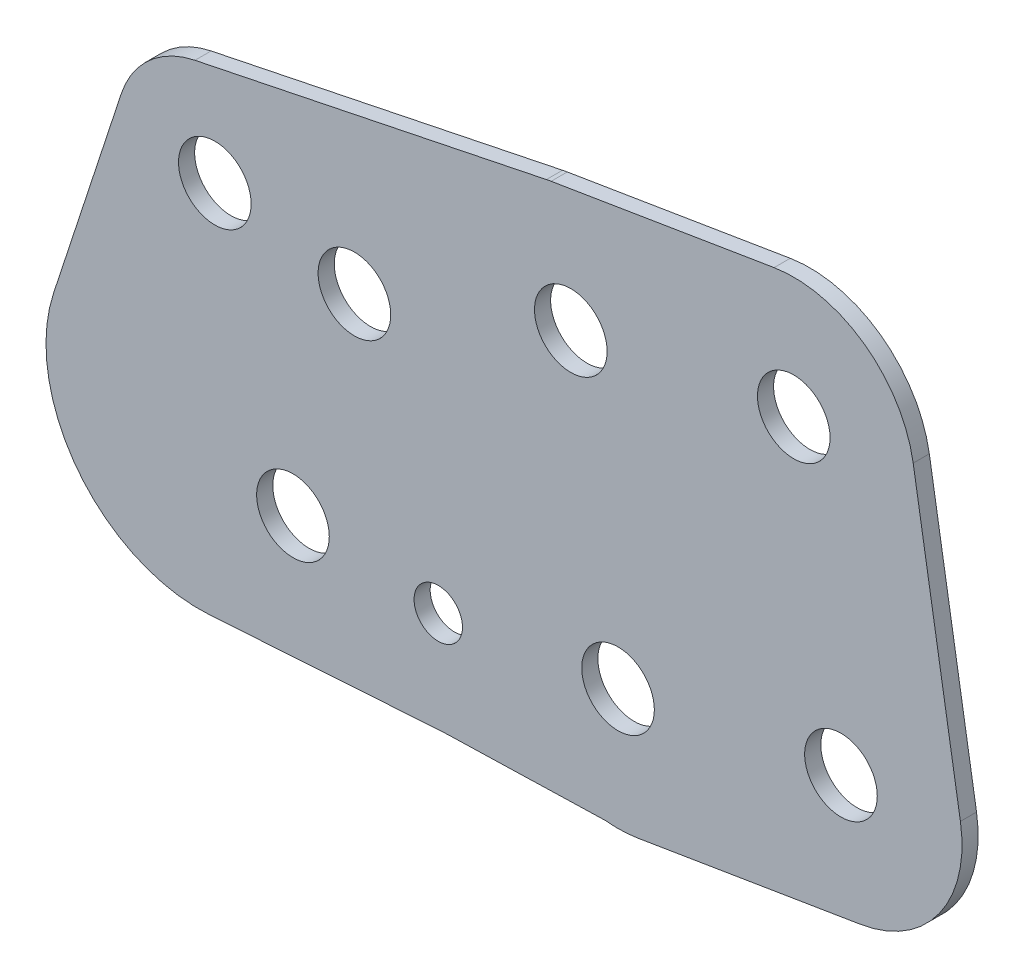
ISO-10303-21;
HEADER;
FILE_DESCRIPTION(('STEP AP214'),'2;1');
FILE_NAME('part.step','',(''),(''),'','','');
FILE_SCHEMA(('AUTOMOTIVE_DESIGN { 1 0 10303 214 1 1 1 1 }'));
ENDSEC;
DATA;
#1=APPLICATION_CONTEXT('core data for automotive mechanical design processes');
#2=APPLICATION_PROTOCOL_DEFINITION('international standard','automotive_design',2000,#1);
#3=PRODUCT_CONTEXT('',#1,'mechanical');
#4=PRODUCT('Part','Part','',(#3));
#5=PRODUCT_RELATED_PRODUCT_CATEGORY('part','',(#4));
#6=PRODUCT_DEFINITION_FORMATION('','',#4);
#7=PRODUCT_DEFINITION_CONTEXT('part definition',#1,'design');
#8=PRODUCT_DEFINITION('design','',#6,#7);
#9=PRODUCT_DEFINITION_SHAPE('','',#8);
#10=(LENGTH_UNIT() NAMED_UNIT(*) SI_UNIT(.MILLI.,.METRE.));
#11=(NAMED_UNIT(*) PLANE_ANGLE_UNIT() SI_UNIT($,.RADIAN.));
#12=(NAMED_UNIT(*) SI_UNIT($,.STERADIAN.) SOLID_ANGLE_UNIT());
#13=UNCERTAINTY_MEASURE_WITH_UNIT(LENGTH_MEASURE(1.E-05),#10,'distance_accuracy_value','');
#14=(GEOMETRIC_REPRESENTATION_CONTEXT(3) GLOBAL_UNCERTAINTY_ASSIGNED_CONTEXT((#13)) GLOBAL_UNIT_ASSIGNED_CONTEXT((#10,
#11,#12)) REPRESENTATION_CONTEXT('',''));
#15=CARTESIAN_POINT('',(0.,0.,0.));
#16=DIRECTION('',(0.,0.,1.));
#17=DIRECTION('',(1.,0.,0.));
#18=AXIS2_PLACEMENT_3D('',#15,#16,#17);
#19=CARTESIAN_POINT('',(530.436947461271,206.021456326038,6.35));
#20=DIRECTION('',(0.,0.,-1.));
#21=DIRECTION('',(-1.,0.,0.));
#22=AXIS2_PLACEMENT_3D('',#19,#20,#21);
#23=CYLINDRICAL_SURFACE('',#22,9.52500000000002);
#24=CARTESIAN_POINT('',(530.436947461271,206.021456326038,6.35));
#25=DIRECTION('',(0.,0.,1.));
#26=DIRECTION('',(1.,0.,0.));
#27=AXIS2_PLACEMENT_3D('',#24,#25,#26);
#28=CIRCLE('',#27,9.52500000000002);
#29=CARTESIAN_POINT('',(539.961947461271,206.021456326038,6.35));
#30=VERTEX_POINT('',#29);
#31=EDGE_CURVE('E252',#30,#30,#28,.T.);
#32=ORIENTED_EDGE('',*,*,#31,.T.);
#33=EDGE_LOOP('',(#32));
#34=FACE_BOUND('',#33,.T.);
#35=CARTESIAN_POINT('',(530.436947461271,206.021456326038,0.));
#36=DIRECTION('',(0.,0.,1.));
#37=DIRECTION('',(1.,0.,0.));
#38=AXIS2_PLACEMENT_3D('',#35,#36,#37);
#39=CIRCLE('',#38,9.52500000000002);
#40=CARTESIAN_POINT('',(539.961947461271,206.021456326038,0.));
#41=VERTEX_POINT('',#40);
#42=EDGE_CURVE('E213',#41,#41,#39,.T.);
#43=ORIENTED_EDGE('',*,*,#42,.F.);
#44=EDGE_LOOP('',(#43));
#45=FACE_BOUND('',#44,.T.);
#46=ADVANCED_FACE('F78',(#34,#45),#23,.F.);
#47=CARTESIAN_POINT('',(688.882784381866,230.124398878091,6.35));
#48=DIRECTION('',(0.,0.,-1.));
#49=DIRECTION('',(-1.,0.,0.));
#50=AXIS2_PLACEMENT_3D('',#47,#48,#49);
#51=CYLINDRICAL_SURFACE('',#50,14.2875);
#52=CARTESIAN_POINT('',(688.882784381866,230.124398878091,6.35));
#53=DIRECTION('',(0.,0.,1.));
#54=DIRECTION('',(1.,0.,0.));
#55=AXIS2_PLACEMENT_3D('',#52,#53,#54);
#56=CIRCLE('',#55,14.2875);
#57=CARTESIAN_POINT('',(703.170284381866,230.124398878091,6.35));
#58=VERTEX_POINT('',#57);
#59=EDGE_CURVE('E249',#58,#58,#56,.T.);
#60=ORIENTED_EDGE('',*,*,#59,.T.);
#61=EDGE_LOOP('',(#60));
#62=FACE_BOUND('',#61,.T.);
#63=CARTESIAN_POINT('',(688.882784381866,230.124398878091,0.));
#64=DIRECTION('',(0.,0.,1.));
#65=DIRECTION('',(1.,0.,0.));
#66=AXIS2_PLACEMENT_3D('',#63,#64,#65);
#67=CIRCLE('',#66,14.2875);
#68=CARTESIAN_POINT('',(703.170284381866,230.124398878091,0.));
#69=VERTEX_POINT('',#68);
#70=EDGE_CURVE('E301',#69,#69,#67,.T.);
#71=ORIENTED_EDGE('',*,*,#70,.F.);
#72=EDGE_LOOP('',(#71));
#73=FACE_BOUND('',#72,.T.);
#74=ADVANCED_FACE('F353',(#62,#73),#51,.F.);
#75=CARTESIAN_POINT('',(670.309034381703,342.905185410778,6.35));
#76=DIRECTION('',(0.,0.,-1.));
#77=DIRECTION('',(-1.,0.,0.));
#78=AXIS2_PLACEMENT_3D('',#75,#76,#77);
#79=CYLINDRICAL_SURFACE('',#78,14.2875);
#80=CARTESIAN_POINT('',(670.309034381703,342.905185410778,6.35));
#81=DIRECTION('',(0.,0.,1.));
#82=DIRECTION('',(1.,0.,0.));
#83=AXIS2_PLACEMENT_3D('',#80,#81,#82);
#84=CIRCLE('',#83,14.2875);
#85=CARTESIAN_POINT('',(684.596534381703,342.905185410778,6.35));
#86=VERTEX_POINT('',#85);
#87=EDGE_CURVE('E246',#86,#86,#84,.T.);
#88=ORIENTED_EDGE('',*,*,#87,.T.);
#89=EDGE_LOOP('',(#88));
#90=FACE_BOUND('',#89,.T.);
#91=CARTESIAN_POINT('',(670.309034381703,342.905185410778,0.));
#92=DIRECTION('',(0.,0.,1.));
#93=DIRECTION('',(1.,0.,0.));
#94=AXIS2_PLACEMENT_3D('',#91,#92,#93);
#95=CIRCLE('',#94,14.2875);
#96=CARTESIAN_POINT('',(684.596534381703,342.905185410778,0.));
#97=VERTEX_POINT('',#96);
#98=EDGE_CURVE('E298',#97,#97,#95,.T.);
#99=ORIENTED_EDGE('',*,*,#98,.F.);
#100=EDGE_LOOP('',(#99));
#101=FACE_BOUND('',#100,.T.);
#102=ADVANCED_FACE('F359',(#90,#101),#79,.F.);
#103=CARTESIAN_POINT('',(582.59064485628,328.458935410651,6.35));
#104=DIRECTION('',(0.,0.,-1.));
#105=DIRECTION('',(-1.,0.,0.));
#106=AXIS2_PLACEMENT_3D('',#103,#104,#105);
#107=CYLINDRICAL_SURFACE('',#106,14.2875);
#108=CARTESIAN_POINT('',(582.59064485628,328.458935410651,6.35));
#109=DIRECTION('',(0.,0.,1.));
#110=DIRECTION('',(1.,0.,0.));
#111=AXIS2_PLACEMENT_3D('',#108,#109,#110);
#112=CIRCLE('',#111,14.2875);
#113=CARTESIAN_POINT('',(596.87814485628,328.458935410651,6.35));
#114=VERTEX_POINT('',#113);
#115=EDGE_CURVE('E243',#114,#114,#112,.T.);
#116=ORIENTED_EDGE('',*,*,#115,.T.);
#117=EDGE_LOOP('',(#116));
#118=FACE_BOUND('',#117,.T.);
#119=CARTESIAN_POINT('',(582.59064485628,328.458935410651,0.));
#120=DIRECTION('',(0.,0.,1.));
#121=DIRECTION('',(1.,0.,0.));
#122=AXIS2_PLACEMENT_3D('',#119,#120,#121);
#123=CIRCLE('',#122,14.2875);
#124=CARTESIAN_POINT('',(596.87814485628,328.458935410651,0.));
#125=VERTEX_POINT('',#124);
#126=EDGE_CURVE('E295',#125,#125,#123,.T.);
#127=ORIENTED_EDGE('',*,*,#126,.F.);
#128=EDGE_LOOP('',(#127));
#129=FACE_BOUND('',#128,.T.);
#130=ADVANCED_FACE('F367',(#118,#129),#107,.F.);
#131=CARTESIAN_POINT('',(497.451942830879,298.348687280984,6.35));
#132=DIRECTION('',(0.,0.,-1.));
#133=DIRECTION('',(-1.,0.,0.));
#134=AXIS2_PLACEMENT_3D('',#131,#132,#133);
#135=CYLINDRICAL_SURFACE('',#134,14.2875);
#136=CARTESIAN_POINT('',(497.451942830879,298.348687280984,6.35));
#137=DIRECTION('',(0.,0.,1.));
#138=DIRECTION('',(1.,0.,0.));
#139=AXIS2_PLACEMENT_3D('',#136,#137,#138);
#140=CIRCLE('',#139,14.2875);
#141=CARTESIAN_POINT('',(511.739442830879,298.348687280984,6.35));
#142=VERTEX_POINT('',#141);
#143=EDGE_CURVE('E240',#142,#142,#140,.T.);
#144=ORIENTED_EDGE('',*,*,#143,.T.);
#145=EDGE_LOOP('',(#144));
#146=FACE_BOUND('',#145,.T.);
#147=CARTESIAN_POINT('',(497.451942830879,298.348687280984,0.));
#148=DIRECTION('',(0.,0.,1.));
#149=DIRECTION('',(1.,0.,0.));
#150=AXIS2_PLACEMENT_3D('',#147,#148,#149);
#151=CIRCLE('',#150,14.2875);
#152=CARTESIAN_POINT('',(511.739442830879,298.348687280984,0.));
#153=VERTEX_POINT('',#152);
#154=EDGE_CURVE('E292',#153,#153,#151,.T.);
#155=ORIENTED_EDGE('',*,*,#154,.F.);
#156=EDGE_LOOP('',(#155));
#157=FACE_BOUND('',#156,.T.);
#158=ADVANCED_FACE('F371',(#146,#157),#135,.F.);
#159=CARTESIAN_POINT('',(442.534139960132,308.673866594183,6.35));
#160=DIRECTION('',(0.,0.,-1.));
#161=DIRECTION('',(-1.,0.,0.));
#162=AXIS2_PLACEMENT_3D('',#159,#160,#161);
#163=CYLINDRICAL_SURFACE('',#162,14.2875);
#164=CARTESIAN_POINT('',(442.534139960132,308.673866594183,6.35));
#165=DIRECTION('',(0.,0.,1.));
#166=DIRECTION('',(1.,0.,0.));
#167=AXIS2_PLACEMENT_3D('',#164,#165,#166);
#168=CIRCLE('',#167,14.2875);
#169=CARTESIAN_POINT('',(456.821639960132,308.673866594183,6.35));
#170=VERTEX_POINT('',#169);
#171=EDGE_CURVE('E237',#170,#170,#168,.T.);
#172=ORIENTED_EDGE('',*,*,#171,.T.);
#173=EDGE_LOOP('',(#172));
#174=FACE_BOUND('',#173,.T.);
#175=CARTESIAN_POINT('',(442.534139960132,308.673866594183,0.));
#176=DIRECTION('',(0.,0.,1.));
#177=DIRECTION('',(1.,0.,0.));
#178=AXIS2_PLACEMENT_3D('',#175,#176,#177);
#179=CIRCLE('',#178,14.2875);
#180=CARTESIAN_POINT('',(456.821639960132,308.673866594183,0.));
#181=VERTEX_POINT('',#180);
#182=EDGE_CURVE('E289',#181,#181,#179,.T.);
#183=ORIENTED_EDGE('',*,*,#182,.F.);
#184=EDGE_LOOP('',(#183));
#185=FACE_BOUND('',#184,.T.);
#186=ADVANCED_FACE('F375',(#174,#185),#163,.F.);
#187=CARTESIAN_POINT('',(473.272722320102,210.704647007323,6.35));
#188=DIRECTION('',(0.,0.,-1.));
#189=DIRECTION('',(-1.,0.,0.));
#190=AXIS2_PLACEMENT_3D('',#187,#188,#189);
#191=CYLINDRICAL_SURFACE('',#190,14.2875);
#192=CARTESIAN_POINT('',(473.272722320102,210.704647007323,6.35));
#193=DIRECTION('',(0.,0.,1.));
#194=DIRECTION('',(1.,0.,0.));
#195=AXIS2_PLACEMENT_3D('',#192,#193,#194);
#196=CIRCLE('',#195,14.2875);
#197=CARTESIAN_POINT('',(487.560222320102,210.704647007323,6.35));
#198=VERTEX_POINT('',#197);
#199=EDGE_CURVE('E188',#198,#198,#196,.T.);
#200=ORIENTED_EDGE('',*,*,#199,.T.);
#201=EDGE_LOOP('',(#200));
#202=FACE_BOUND('',#201,.T.);
#203=CARTESIAN_POINT('',(473.272722320102,210.704647007323,0.));
#204=DIRECTION('',(0.,0.,1.));
#205=DIRECTION('',(1.,0.,0.));
#206=AXIS2_PLACEMENT_3D('',#203,#204,#205);
#207=CIRCLE('',#206,14.2875);
#208=CARTESIAN_POINT('',(487.560222320102,210.704647007323,0.));
#209=VERTEX_POINT('',#208);
#210=EDGE_CURVE('E200',#209,#209,#207,.T.);
#211=ORIENTED_EDGE('',*,*,#210,.F.);
#212=EDGE_LOOP('',(#211));
#213=FACE_BOUND('',#212,.T.);
#214=ADVANCED_FACE('F379',(#202,#213),#191,.F.);
#215=CARTESIAN_POINT('',(-10.9683044249653,66.6001211369095,6.35));
#216=DIRECTION('',(-0.162500000001426,0.986708543593059,0.));
#217=DIRECTION('',(-0.986708543593059,-0.162500000001426,0.));
#218=AXIS2_PLACEMENT_3D('',#215,#216,#217);
#219=PLANE('',#218);
#220=DIRECTION('',(0.98670854359306,0.162500000001426,0.));
#221=VECTOR('',#220,1.);
#222=CARTESIAN_POINT('',(-10.9683044249653,66.6001211369095,0.));
#223=LINE('',#222,#221);
#224=CARTESIAN_POINT('',(608.903457356511,168.686154489345,0.));
#225=VERTEX_POINT('',#224);
#226=CARTESIAN_POINT('',(696.621846881934,183.132404489472,0.));
#227=VERTEX_POINT('',#226);
#228=EDGE_CURVE('E261',#225,#227,#223,.T.);
#229=ORIENTED_EDGE('',*,*,#228,.T.);
#230=DIRECTION('',(0.,0.,-1.));
#231=VECTOR('',#230,1.);
#232=CARTESIAN_POINT('',(696.621846881934,183.132404489472,6.35));
#233=LINE('',#232,#231);
#234=CARTESIAN_POINT('',(696.621846881934,183.132404489472,6.35));
#235=VERTEX_POINT('',#234);
#236=EDGE_CURVE('E195',#235,#227,#233,.T.);
#237=ORIENTED_EDGE('',*,*,#236,.F.);
#238=DIRECTION('',(0.98670854359306,0.162500000001426,0.));
#239=VECTOR('',#238,1.);
#240=CARTESIAN_POINT('',(-10.9683044249653,66.6001211369095,6.35));
#241=LINE('',#240,#239);
#242=CARTESIAN_POINT('',(608.903457356511,168.686154489345,6.35));
#243=VERTEX_POINT('',#242);
#244=EDGE_CURVE('E176',#243,#235,#241,.T.);
#245=ORIENTED_EDGE('',*,*,#244,.F.);
#246=DIRECTION('',(0.,0.,-1.));
#247=VECTOR('',#246,1.);
#248=CARTESIAN_POINT('',(608.903457356511,168.686154489345,6.35));
#249=LINE('',#248,#247);
#250=EDGE_CURVE('E193',#243,#225,#249,.T.);
#251=ORIENTED_EDGE('',*,*,#250,.T.);
#252=EDGE_LOOP('',(#229,#237,#245,#251));
#253=FACE_BOUND('',#252,.T.);
#254=ADVANCED_FACE('F342',(#253),#219,.F.);
#255=CARTESIAN_POINT('',(688.882784381866,230.124398878091,6.35));
#256=DIRECTION('',(0.,0.,-1.));
#257=DIRECTION('',(-1.,0.,0.));
#258=AXIS2_PLACEMENT_3D('',#255,#256,#257);
#259=CYLINDRICAL_SURFACE('',#258,47.625);
#260=CARTESIAN_POINT('',(688.882784381866,230.124398878091,0.));
#261=DIRECTION('',(0.,0.,1.));
#262=DIRECTION('',(1.,0.,0.));
#263=AXIS2_PLACEMENT_3D('',#260,#261,#262);
#264=CIRCLE('',#263,47.625);
#265=CARTESIAN_POINT('',(735.874778770485,237.863461378159,0.));
#266=VERTEX_POINT('',#265);
#267=EDGE_CURVE('E263',#227,#266,#264,.T.);
#268=ORIENTED_EDGE('',*,*,#267,.T.);
#269=DIRECTION('',(0.,0.,-1.));
#270=VECTOR('',#269,1.);
#271=CARTESIAN_POINT('',(735.874778770485,237.863461378159,6.35));
#272=LINE('',#271,#270);
#273=CARTESIAN_POINT('',(735.874778770485,237.863461378159,6.35));
#274=VERTEX_POINT('',#273);
#275=EDGE_CURVE('E321',#274,#266,#272,.T.);
#276=ORIENTED_EDGE('',*,*,#275,.F.);
#277=CARTESIAN_POINT('',(688.882784381866,230.124398878091,6.35));
#278=DIRECTION('',(0.,0.,1.));
#279=DIRECTION('',(1.,0.,0.));
#280=AXIS2_PLACEMENT_3D('',#277,#278,#279);
#281=CIRCLE('',#280,47.625);
#282=EDGE_CURVE('E216',#235,#274,#281,.T.);
#283=ORIENTED_EDGE('',*,*,#282,.F.);
#284=ORIENTED_EDGE('',*,*,#236,.T.);
#285=EDGE_LOOP('',(#268,#276,#283,#284));
#286=FACE_BOUND('',#285,.T.);
#287=ADVANCED_FACE('F327',(#286),#259,.T.);
#288=CARTESIAN_POINT('',(754.582145695519,124.271345852626,6.35));
#289=DIRECTION('',(0.98670854359306,0.162500000001421,0.));
#290=DIRECTION('',(-0.162500000001421,0.98670854359306,0.));
#291=AXIS2_PLACEMENT_3D('',#288,#289,#290);
#292=PLANE('',#291);
#293=DIRECTION('',(0.162500000001421,-0.98670854359306,0.));
#294=VECTOR('',#293,1.);
#295=CARTESIAN_POINT('',(754.582145695519,124.271345852626,0.));
#296=LINE('',#295,#294);
#297=CARTESIAN_POINT('',(717.301028770323,350.644247910846,0.));
#298=VERTEX_POINT('',#297);
#299=EDGE_CURVE('E266',#298,#266,#296,.T.);
#300=ORIENTED_EDGE('',*,*,#299,.F.);
#301=DIRECTION('',(0.,0.,-1.));
#302=VECTOR('',#301,1.);
#303=CARTESIAN_POINT('',(717.301028770323,350.644247910846,6.35));
#304=LINE('',#303,#302);
#305=CARTESIAN_POINT('',(717.301028770323,350.644247910846,6.35));
#306=VERTEX_POINT('',#305);
#307=EDGE_CURVE('E319',#306,#298,#304,.T.);
#308=ORIENTED_EDGE('',*,*,#307,.F.);
#309=DIRECTION('',(0.162500000001421,-0.98670854359306,0.));
#310=VECTOR('',#309,1.);
#311=CARTESIAN_POINT('',(754.582145695519,124.271345852626,6.35));
#312=LINE('',#311,#310);
#313=EDGE_CURVE('E218',#306,#274,#312,.T.);
#314=ORIENTED_EDGE('',*,*,#313,.T.);
#315=ORIENTED_EDGE('',*,*,#275,.T.);
#316=EDGE_LOOP('',(#300,#308,#314,#315));
#317=FACE_BOUND('',#316,.T.);
#318=ADVANCED_FACE('F337',(#317),#292,.T.);
#319=CARTESIAN_POINT('',(670.309034381703,342.905185410778,6.35));
#320=DIRECTION('',(0.,0.,-1.));
#321=DIRECTION('',(-1.,0.,0.));
#322=AXIS2_PLACEMENT_3D('',#319,#320,#321);
#323=CYLINDRICAL_SURFACE('',#322,47.6250000000007);
#324=CARTESIAN_POINT('',(670.309034381703,342.905185410778,0.));
#325=DIRECTION('',(0.,0.,1.));
#326=DIRECTION('',(1.,0.,0.));
#327=AXIS2_PLACEMENT_3D('',#324,#325,#326);
#328=CIRCLE('',#327,47.6250000000007);
#329=CARTESIAN_POINT('',(662.569971881635,389.897179799398,0.));
#330=VERTEX_POINT('',#329);
#331=EDGE_CURVE('E269',#298,#330,#328,.T.);
#332=ORIENTED_EDGE('',*,*,#331,.T.);
#333=DIRECTION('',(0.,0.,-1.));
#334=VECTOR('',#333,1.);
#335=CARTESIAN_POINT('',(662.569971881635,389.897179799398,6.35));
#336=LINE('',#335,#334);
#337=CARTESIAN_POINT('',(662.569971881635,389.897179799398,6.35));
#338=VERTEX_POINT('',#337);
#339=EDGE_CURVE('E317',#338,#330,#336,.T.);
#340=ORIENTED_EDGE('',*,*,#339,.F.);
#341=CARTESIAN_POINT('',(670.309034381703,342.905185410778,6.35));
#342=DIRECTION('',(0.,0.,1.));
#343=DIRECTION('',(1.,0.,0.));
#344=AXIS2_PLACEMENT_3D('',#341,#342,#343);
#345=CIRCLE('',#344,47.6250000000007);
#346=EDGE_CURVE('E221',#306,#338,#345,.T.);
#347=ORIENTED_EDGE('',*,*,#346,.F.);
#348=ORIENTED_EDGE('',*,*,#307,.T.);
#349=EDGE_LOOP('',(#332,#340,#347,#348));
#350=FACE_BOUND('',#349,.T.);
#351=ADVANCED_FACE('F404',(#350),#323,.T.);
#352=CARTESIAN_POINT('',(-45.0201794252642,273.364896446836,6.35));
#353=DIRECTION('',(-0.162500000001426,0.986708543593059,0.));
#354=DIRECTION('',(-0.986708543593059,-0.162500000001426,0.));
#355=AXIS2_PLACEMENT_3D('',#352,#353,#354);
#356=PLANE('',#355);
#357=DIRECTION('',(0.986708543593059,0.162500000001426,0.));
#358=VECTOR('',#357,1.);
#359=CARTESIAN_POINT('',(-45.0201794252642,273.364896446836,0.));
#360=LINE('',#359,#358);
#361=CARTESIAN_POINT('',(574.851582356212,375.450929799271,0.));
#362=VERTEX_POINT('',#361);
#363=EDGE_CURVE('E272',#362,#330,#360,.T.);
#364=ORIENTED_EDGE('',*,*,#363,.F.);
#365=DIRECTION('',(0.,0.,-1.));
#366=VECTOR('',#365,1.);
#367=CARTESIAN_POINT('',(574.851582356212,375.450929799271,6.35));
#368=LINE('',#367,#366);
#369=CARTESIAN_POINT('',(574.851582356212,375.450929799271,6.35));
#370=VERTEX_POINT('',#369);
#371=EDGE_CURVE('E315',#370,#362,#368,.T.);
#372=ORIENTED_EDGE('',*,*,#371,.F.);
#373=DIRECTION('',(0.986708543593059,0.162500000001426,0.));
#374=VECTOR('',#373,1.);
#375=CARTESIAN_POINT('',(-45.0201794252642,273.364896446836,6.35));
#376=LINE('',#375,#374);
#377=EDGE_CURVE('E223',#370,#338,#376,.T.);
#378=ORIENTED_EDGE('',*,*,#377,.T.);
#379=ORIENTED_EDGE('',*,*,#339,.T.);
#380=EDGE_LOOP('',(#364,#372,#378,#379));
#381=FACE_BOUND('',#380,.T.);
#382=ADVANCED_FACE('F400',(#381),#356,.T.);
#383=CARTESIAN_POINT('',(582.59064485628,328.458935410651,6.35));
#384=DIRECTION('',(0.,0.,-1.));
#385=DIRECTION('',(-1.,0.,0.));
#386=AXIS2_PLACEMENT_3D('',#383,#384,#385);
#387=CYLINDRICAL_SURFACE('',#386,47.6250000000007);
#388=CARTESIAN_POINT('',(582.59064485628,328.458935410651,0.));
#389=DIRECTION('',(0.,0.,1.));
#390=DIRECTION('',(1.,0.,0.));
#391=AXIS2_PLACEMENT_3D('',#388,#389,#390);
#392=CIRCLE('',#391,47.6250000000007);
#393=CARTESIAN_POINT('',(572.978392317902,375.103819654676,0.));
#394=VERTEX_POINT('',#393);
#395=EDGE_CURVE('E275',#362,#394,#392,.T.);
#396=ORIENTED_EDGE('',*,*,#395,.T.);
#397=DIRECTION('',(0.,0.,-1.));
#398=VECTOR('',#397,1.);
#399=CARTESIAN_POINT('',(572.978392317902,375.103819654676,6.35));
#400=LINE('',#399,#398);
#401=CARTESIAN_POINT('',(572.978392317902,375.103819654676,6.35));
#402=VERTEX_POINT('',#401);
#403=EDGE_CURVE('E313',#402,#394,#400,.T.);
#404=ORIENTED_EDGE('',*,*,#403,.F.);
#405=CARTESIAN_POINT('',(582.59064485628,328.458935410651,6.35));
#406=DIRECTION('',(0.,0.,1.));
#407=DIRECTION('',(1.,0.,0.));
#408=AXIS2_PLACEMENT_3D('',#405,#406,#407);
#409=CIRCLE('',#408,47.6250000000007);
#410=EDGE_CURVE('E226',#370,#402,#409,.T.);
#411=ORIENTED_EDGE('',*,*,#410,.F.);
#412=ORIENTED_EDGE('',*,*,#371,.T.);
#413=EDGE_LOOP('',(#396,#404,#411,#412));
#414=FACE_BOUND('',#413,.T.);
#415=ADVANCED_FACE('F396',(#414),#387,.T.);
#416=CARTESIAN_POINT('',(-50.8089679621859,246.558069473552,6.35));
#417=DIRECTION('',(-0.201832074296634,0.979420141606817,0.));
#418=DIRECTION('',(-0.979420141606817,-0.201832074296634,0.));
#419=AXIS2_PLACEMENT_3D('',#416,#417,#418);
#420=PLANE('',#419);
#421=DIRECTION('',(0.979420141606817,0.201832074296634,0.));
#422=VECTOR('',#421,1.);
#423=CARTESIAN_POINT('',(-50.8089679621859,246.558069473552,0.));
#424=LINE('',#423,#422);
#425=CARTESIAN_POINT('',(434.716174562252,346.611705779323,0.));
#426=VERTEX_POINT('',#425);
#427=EDGE_CURVE('E278',#426,#394,#424,.T.);
#428=ORIENTED_EDGE('',*,*,#427,.F.);
#429=DIRECTION('',(0.,0.,-1.));
#430=VECTOR('',#429,1.);
#431=CARTESIAN_POINT('',(434.716174562252,346.611705779323,6.35));
#432=LINE('',#431,#430);
#433=CARTESIAN_POINT('',(434.716174562252,346.611705779323,6.35));
#434=VERTEX_POINT('',#433);
#435=EDGE_CURVE('E311',#434,#426,#432,.T.);
#436=ORIENTED_EDGE('',*,*,#435,.F.);
#437=DIRECTION('',(0.979420141606817,0.201832074296634,0.));
#438=VECTOR('',#437,1.);
#439=CARTESIAN_POINT('',(-50.8089679621859,246.558069473552,6.35));
#440=LINE('',#439,#438);
#441=EDGE_CURVE('E228',#434,#402,#440,.T.);
#442=ORIENTED_EDGE('',*,*,#441,.T.);
#443=ORIENTED_EDGE('',*,*,#403,.T.);
#444=EDGE_LOOP('',(#428,#436,#442,#443));
#445=FACE_BOUND('',#444,.T.);
#446=ADVANCED_FACE('F392',(#445),#420,.T.);
#447=CARTESIAN_POINT('',(442.534139960132,308.673866594183,6.35));
#448=DIRECTION('',(0.,0.,-1.));
#449=DIRECTION('',(-1.,0.,0.));
#450=AXIS2_PLACEMENT_3D('',#447,#448,#449);
#451=CYLINDRICAL_SURFACE('',#450,38.735);
#452=CARTESIAN_POINT('',(442.534139960132,308.673866594183,0.));
#453=DIRECTION('',(0.,0.,1.));
#454=DIRECTION('',(1.,0.,0.));
#455=AXIS2_PLACEMENT_3D('',#452,#453,#454);
#456=CIRCLE('',#455,38.735);
#457=CARTESIAN_POINT('',(405.725523576661,320.737281738099,0.));
#458=VERTEX_POINT('',#457);
#459=EDGE_CURVE('E281',#426,#458,#456,.T.);
#460=ORIENTED_EDGE('',*,*,#459,.T.);
#461=DIRECTION('',(0.,0.,-1.));
#462=VECTOR('',#461,1.);
#463=CARTESIAN_POINT('',(405.725523576661,320.737281738099,6.35));
#464=LINE('',#463,#462);
#465=CARTESIAN_POINT('',(405.725523576661,320.737281738099,6.35));
#466=VERTEX_POINT('',#465);
#467=EDGE_CURVE('E309',#466,#458,#464,.T.);
#468=ORIENTED_EDGE('',*,*,#467,.F.);
#469=CARTESIAN_POINT('',(442.534139960132,308.673866594183,6.35));
#470=DIRECTION('',(0.,0.,1.));
#471=DIRECTION('',(1.,0.,0.));
#472=AXIS2_PLACEMENT_3D('',#469,#470,#471);
#473=CIRCLE('',#472,38.735);
#474=EDGE_CURVE('E231',#434,#466,#473,.T.);
#475=ORIENTED_EDGE('',*,*,#474,.F.);
#476=ORIENTED_EDGE('',*,*,#435,.T.);
#477=EDGE_LOOP('',(#460,#468,#475,#476));
#478=FACE_BOUND('',#477,.T.);
#479=ADVANCED_FACE('F388',(#478),#451,.T.);
#480=CARTESIAN_POINT('',(271.452665974111,-88.9641209942094,6.35));
#481=DIRECTION('',(-0.950267623169511,0.311434494486029,0.));
#482=DIRECTION('',(-0.311434494486029,-0.950267623169511,0.));
#483=AXIS2_PLACEMENT_3D('',#480,#481,#482);
#484=PLANE('',#483);
#485=DIRECTION('',(0.311434494486029,0.950267623169511,0.));
#486=VECTOR('',#485,1.);
#487=CARTESIAN_POINT('',(271.452665974111,-88.9641209942094,0.));
#488=LINE('',#487,#486);
#489=CARTESIAN_POINT('',(379.105702514178,239.51328587987,0.));
#490=VERTEX_POINT('',#489);
#491=EDGE_CURVE('E284',#490,#458,#488,.T.);
#492=ORIENTED_EDGE('',*,*,#491,.F.);
#493=DIRECTION('',(0.,0.,-1.));
#494=VECTOR('',#493,1.);
#495=CARTESIAN_POINT('',(379.105702514178,239.51328587987,6.35));
#496=LINE('',#495,#494);
#497=CARTESIAN_POINT('',(379.105702514178,239.51328587987,6.35));
#498=VERTEX_POINT('',#497);
#499=EDGE_CURVE('E307',#498,#490,#496,.T.);
#500=ORIENTED_EDGE('',*,*,#499,.F.);
#501=DIRECTION('',(0.311434494486029,0.950267623169511,0.));
#502=VECTOR('',#501,1.);
#503=CARTESIAN_POINT('',(271.452665974111,-88.9641209942094,6.35));
#504=LINE('',#503,#502);
#505=EDGE_CURVE('E233',#498,#466,#504,.T.);
#506=ORIENTED_EDGE('',*,*,#505,.T.);
#507=ORIENTED_EDGE('',*,*,#467,.T.);
#508=EDGE_LOOP('',(#492,#500,#506,#507));
#509=FACE_BOUND('',#508,.T.);
#510=ADVANCED_FACE('F384',(#509),#484,.T.);
#511=CARTESIAN_POINT('',(436.430596881879,220.726,6.35));
#512=DIRECTION('',(0.,0.,-1.));
#513=DIRECTION('',(-1.,0.,0.));
#514=AXIS2_PLACEMENT_3D('',#511,#512,#513);
#515=CYLINDRICAL_SURFACE('',#514,60.325);
#516=CARTESIAN_POINT('',(436.430596881879,220.726,0.));
#517=DIRECTION('',(0.,0.,1.));
#518=DIRECTION('',(1.,0.,0.));
#519=AXIS2_PLACEMENT_3D('',#516,#517,#518);
#520=CIRCLE('',#519,60.325);
#521=CARTESIAN_POINT('',(440.362185757647,160.529253959106,0.));
#522=VERTEX_POINT('',#521);
#523=EDGE_CURVE('E287',#490,#522,#520,.T.);
#524=ORIENTED_EDGE('',*,*,#523,.T.);
#525=DIRECTION('',(0.,0.,-1.));
#526=VECTOR('',#525,1.);
#527=CARTESIAN_POINT('',(440.362185757647,160.529253959106,6.35));
#528=LINE('',#527,#526);
#529=CARTESIAN_POINT('',(440.362185757647,160.529253959106,6.35));
#530=VERTEX_POINT('',#529);
#531=EDGE_CURVE('E255',#530,#522,#528,.T.);
#532=ORIENTED_EDGE('',*,*,#531,.F.);
#533=CARTESIAN_POINT('',(436.430596881879,220.726,6.35));
#534=DIRECTION('',(0.,0.,1.));
#535=DIRECTION('',(1.,0.,0.));
#536=AXIS2_PLACEMENT_3D('',#533,#534,#535);
#537=CIRCLE('',#536,60.325);
#538=EDGE_CURVE('E184',#498,#530,#537,.T.);
#539=ORIENTED_EDGE('',*,*,#538,.F.);
#540=ORIENTED_EDGE('',*,*,#499,.T.);
#541=EDGE_LOOP('',(#524,#532,#539,#540));
#542=FACE_BOUND('',#541,.T.);
#543=ADVANCED_FACE('F381',(#542),#515,.T.);
#544=CARTESIAN_POINT('',(-8.56952992087254,131.20848405998,6.35));
#545=DIRECTION('',(-0.065173458363333,0.997873950118432,0.));
#546=DIRECTION('',(-0.997873950118432,-0.065173458363333,0.));
#547=AXIS2_PLACEMENT_3D('',#544,#545,#546);
#548=PLANE('',#547);
#549=DIRECTION('',(0.997873950118432,0.065173458363333,0.));
#550=VECTOR('',#549,1.);
#551=CARTESIAN_POINT('',(-8.56952992087254,131.20848405998,0.));
#552=LINE('',#551,#550);
#553=CARTESIAN_POINT('',(532.280779924723,166.532670191239,0.));
#554=VERTEX_POINT('',#553);
#555=EDGE_CURVE('E192',#522,#554,#552,.T.);
#556=ORIENTED_EDGE('',*,*,#555,.T.);
#557=DIRECTION('',(0.,0.,-1.));
#558=VECTOR('',#557,1.);
#559=CARTESIAN_POINT('',(532.280779924723,166.532670191239,6.35));
#560=LINE('',#559,#558);
#561=CARTESIAN_POINT('',(532.280779924723,166.532670191239,6.35));
#562=VERTEX_POINT('',#561);
#563=EDGE_CURVE('E86',#562,#554,#560,.T.);
#564=ORIENTED_EDGE('',*,*,#563,.F.);
#565=DIRECTION('',(0.997873950118432,0.065173458363333,0.));
#566=VECTOR('',#565,1.);
#567=CARTESIAN_POINT('',(-8.56952992087254,131.20848405998,6.35));
#568=LINE('',#567,#566);
#569=EDGE_CURVE('E177',#530,#562,#568,.T.);
#570=ORIENTED_EDGE('',*,*,#569,.F.);
#571=ORIENTED_EDGE('',*,*,#531,.T.);
#572=EDGE_LOOP('',(#556,#564,#570,#571));
#573=FACE_BOUND('',#572,.T.);
#574=ADVANCED_FACE('F190',(#573),#548,.F.);
#575=CARTESIAN_POINT('',(-4.25660166170212,151.453259430347,6.35));
#576=DIRECTION('',(-0.0280939581036253,0.999605286859804,0.));
#577=DIRECTION('',(-0.999605286859804,-0.0280939581036253,0.));
#578=AXIS2_PLACEMENT_3D('',#575,#576,#577);
#579=PLANE('',#578);
#580=DIRECTION('',(0.,0.,-1.));
#581=VECTOR('',#580,1.);
#582=CARTESIAN_POINT('',(596.076888833106,168.325663119955,6.35));
#583=LINE('',#582,#581);
#584=CARTESIAN_POINT('',(596.076888833106,168.325663119955,6.35));
#585=VERTEX_POINT('',#584);
#586=CARTESIAN_POINT('',(596.076888833106,168.325663119955,0.));
#587=VERTEX_POINT('',#586);
#588=EDGE_CURVE('E12',#585,#587,#583,.T.);
#589=ORIENTED_EDGE('',*,*,#588,.F.);
#590=DIRECTION('',(0.999605286859804,0.0280939581036253,0.));
#591=VECTOR('',#590,1.);
#592=CARTESIAN_POINT('',(-4.25660166170212,151.453259430347,6.35));
#593=LINE('',#592,#591);
#594=EDGE_CURVE('E169',#562,#585,#593,.T.);
#595=ORIENTED_EDGE('',*,*,#594,.F.);
#596=ORIENTED_EDGE('',*,*,#563,.T.);
#597=DIRECTION('',(0.999605286859804,0.0280939581036253,0.));
#598=VECTOR('',#597,1.);
#599=CARTESIAN_POINT('',(-4.25660166170212,151.453259430347,0.));
#600=LINE('',#599,#598);
#601=EDGE_CURVE('E259',#554,#587,#600,.T.);
#602=ORIENTED_EDGE('',*,*,#601,.T.);
#603=EDGE_LOOP('',(#589,#595,#596,#602));
#604=FACE_BOUND('',#603,.T.);
#605=ADVANCED_FACE('F171',(#604),#579,.F.);
#606=CARTESIAN_POINT('',(0.,0.,0.));
#607=DIRECTION('',(0.,0.,1.));
#608=DIRECTION('',(1.,0.,0.));
#609=AXIS2_PLACEMENT_3D('',#606,#607,#608);
#610=PLANE('',#609);
#611=CARTESIAN_POINT('',(601.164394856443,215.678148877964,0.));
#612=DIRECTION('',(0.,0.,1.));
#613=DIRECTION('',(1.,0.,0.));
#614=AXIS2_PLACEMENT_3D('',#611,#612,#613);
#615=CIRCLE('',#614,14.2875);
#616=CARTESIAN_POINT('',(615.451894856443,215.678148877964,0.));
#617=VERTEX_POINT('',#616);
#618=EDGE_CURVE('E205',#617,#617,#615,.T.);
#619=ORIENTED_EDGE('',*,*,#618,.T.);
#620=EDGE_LOOP('',(#619));
#621=FACE_BOUND('',#620,.T.);
#622=ORIENTED_EDGE('',*,*,#228,.F.);
#623=CARTESIAN_POINT('',(601.164394856443,215.678148877964,0.));
#624=DIRECTION('',(0.,0.,1.));
#625=DIRECTION('',(1.,0.,0.));
#626=AXIS2_PLACEMENT_3D('',#623,#624,#625);
#627=CIRCLE('',#626,47.625);
#628=EDGE_CURVE('E201',#587,#225,#627,.T.);
#629=ORIENTED_EDGE('',*,*,#628,.F.);
#630=ORIENTED_EDGE('',*,*,#601,.F.);
#631=ORIENTED_EDGE('',*,*,#555,.F.);
#632=ORIENTED_EDGE('',*,*,#523,.F.);
#633=ORIENTED_EDGE('',*,*,#491,.T.);
#634=ORIENTED_EDGE('',*,*,#459,.F.);
#635=ORIENTED_EDGE('',*,*,#427,.T.);
#636=ORIENTED_EDGE('',*,*,#395,.F.);
#637=ORIENTED_EDGE('',*,*,#363,.T.);
#638=ORIENTED_EDGE('',*,*,#331,.F.);
#639=ORIENTED_EDGE('',*,*,#299,.T.);
#640=ORIENTED_EDGE('',*,*,#267,.F.);
#641=EDGE_LOOP('',(#622,#629,#630,#631,#632,#633,#634,#635,#636,#637,#638,#639,#640));
#642=FACE_BOUND('',#641,.T.);
#643=ORIENTED_EDGE('',*,*,#210,.T.);
#644=EDGE_LOOP('',(#643));
#645=FACE_BOUND('',#644,.T.);
#646=ORIENTED_EDGE('',*,*,#182,.T.);
#647=EDGE_LOOP('',(#646));
#648=FACE_BOUND('',#647,.T.);
#649=ORIENTED_EDGE('',*,*,#154,.T.);
#650=EDGE_LOOP('',(#649));
#651=FACE_BOUND('',#650,.T.);
#652=ORIENTED_EDGE('',*,*,#126,.T.);
#653=EDGE_LOOP('',(#652));
#654=FACE_BOUND('',#653,.T.);
#655=ORIENTED_EDGE('',*,*,#98,.T.);
#656=EDGE_LOOP('',(#655));
#657=FACE_BOUND('',#656,.T.);
#658=ORIENTED_EDGE('',*,*,#70,.T.);
#659=EDGE_LOOP('',(#658));
#660=FACE_BOUND('',#659,.T.);
#661=ORIENTED_EDGE('',*,*,#42,.T.);
#662=EDGE_LOOP('',(#661));
#663=FACE_BOUND('',#662,.T.);
#664=ADVANCED_FACE('F332',(#621,#642,#645,#648,#651,#654,#657,#660,#663),#610,.F.);
#665=CARTESIAN_POINT('',(0.,0.,6.35));
#666=DIRECTION('',(0.,0.,1.));
#667=DIRECTION('',(1.,0.,0.));
#668=AXIS2_PLACEMENT_3D('',#665,#666,#667);
#669=PLANE('',#668);
#670=CARTESIAN_POINT('',(601.164394856443,215.678148877964,6.35));
#671=DIRECTION('',(0.,0.,1.));
#672=DIRECTION('',(1.,0.,0.));
#673=AXIS2_PLACEMENT_3D('',#670,#671,#672);
#674=CIRCLE('',#673,14.2875);
#675=CARTESIAN_POINT('',(615.451894856443,215.678148877964,6.35));
#676=VERTEX_POINT('',#675);
#677=EDGE_CURVE('E202',#676,#676,#674,.T.);
#678=ORIENTED_EDGE('',*,*,#677,.F.);
#679=EDGE_LOOP('',(#678));
#680=FACE_BOUND('',#679,.T.);
#681=ORIENTED_EDGE('',*,*,#199,.F.);
#682=EDGE_LOOP('',(#681));
#683=FACE_BOUND('',#682,.T.);
#684=ORIENTED_EDGE('',*,*,#594,.T.);
#685=CARTESIAN_POINT('',(601.164394856443,215.678148877964,6.35));
#686=DIRECTION('',(0.,0.,1.));
#687=DIRECTION('',(1.,0.,0.));
#688=AXIS2_PLACEMENT_3D('',#685,#686,#687);
#689=CIRCLE('',#688,47.625);
#690=EDGE_CURVE('E199',#585,#243,#689,.T.);
#691=ORIENTED_EDGE('',*,*,#690,.T.);
#692=ORIENTED_EDGE('',*,*,#244,.T.);
#693=ORIENTED_EDGE('',*,*,#282,.T.);
#694=ORIENTED_EDGE('',*,*,#313,.F.);
#695=ORIENTED_EDGE('',*,*,#346,.T.);
#696=ORIENTED_EDGE('',*,*,#377,.F.);
#697=ORIENTED_EDGE('',*,*,#410,.T.);
#698=ORIENTED_EDGE('',*,*,#441,.F.);
#699=ORIENTED_EDGE('',*,*,#474,.T.);
#700=ORIENTED_EDGE('',*,*,#505,.F.);
#701=ORIENTED_EDGE('',*,*,#538,.T.);
#702=ORIENTED_EDGE('',*,*,#569,.T.);
#703=EDGE_LOOP('',(#684,#691,#692,#693,#694,#695,#696,#697,#698,#699,#700,#701,#702));
#704=FACE_BOUND('',#703,.T.);
#705=ORIENTED_EDGE('',*,*,#171,.F.);
#706=EDGE_LOOP('',(#705));
#707=FACE_BOUND('',#706,.T.);
#708=ORIENTED_EDGE('',*,*,#143,.F.);
#709=EDGE_LOOP('',(#708));
#710=FACE_BOUND('',#709,.T.);
#711=ORIENTED_EDGE('',*,*,#115,.F.);
#712=EDGE_LOOP('',(#711));
#713=FACE_BOUND('',#712,.T.);
#714=ORIENTED_EDGE('',*,*,#87,.F.);
#715=EDGE_LOOP('',(#714));
#716=FACE_BOUND('',#715,.T.);
#717=ORIENTED_EDGE('',*,*,#59,.F.);
#718=EDGE_LOOP('',(#717));
#719=FACE_BOUND('',#718,.T.);
#720=ORIENTED_EDGE('',*,*,#31,.F.);
#721=EDGE_LOOP('',(#720));
#722=FACE_BOUND('',#721,.T.);
#723=ADVANCED_FACE('F180',(#680,#683,#704,#707,#710,#713,#716,#719,#722),#669,.T.);
#724=CARTESIAN_POINT('',(601.164394856443,215.678148877964,6.35));
#725=DIRECTION('',(0.,0.,-1.));
#726=DIRECTION('',(-1.,0.,0.));
#727=AXIS2_PLACEMENT_3D('',#724,#725,#726);
#728=CYLINDRICAL_SURFACE('',#727,47.625);
#729=ORIENTED_EDGE('',*,*,#690,.F.);
#730=ORIENTED_EDGE('',*,*,#588,.T.);
#731=ORIENTED_EDGE('',*,*,#628,.T.);
#732=ORIENTED_EDGE('',*,*,#250,.F.);
#733=EDGE_LOOP('',(#729,#730,#731,#732));
#734=FACE_BOUND('',#733,.T.);
#735=ADVANCED_FACE('F80',(#734),#728,.T.);
#736=CARTESIAN_POINT('',(601.164394856443,215.678148877964,6.35));
#737=DIRECTION('',(0.,0.,-1.));
#738=DIRECTION('',(-1.,0.,0.));
#739=AXIS2_PLACEMENT_3D('',#736,#737,#738);
#740=CYLINDRICAL_SURFACE('',#739,14.2875);
#741=ORIENTED_EDGE('',*,*,#677,.T.);
#742=EDGE_LOOP('',(#741));
#743=FACE_BOUND('',#742,.T.);
#744=ORIENTED_EDGE('',*,*,#618,.F.);
#745=EDGE_LOOP('',(#744));
#746=FACE_BOUND('',#745,.T.);
#747=ADVANCED_FACE('F344',(#743,#746),#740,.F.);
#748=CLOSED_SHELL('',(#46,#74,#102,#130,#158,#186,#214,#254,#287,#318,#351,#382,#415,#446,#479,
#510,#543,#574,#605,#664,#723,#735,#747));
#749=MANIFOLD_SOLID_BREP('B2',#748);
#750=ADVANCED_BREP_SHAPE_REPRESENTATION('',(#18,#749),#14);
#751=SHAPE_DEFINITION_REPRESENTATION(#9,#750);
ENDSEC;
END-ISO-10303-21;
